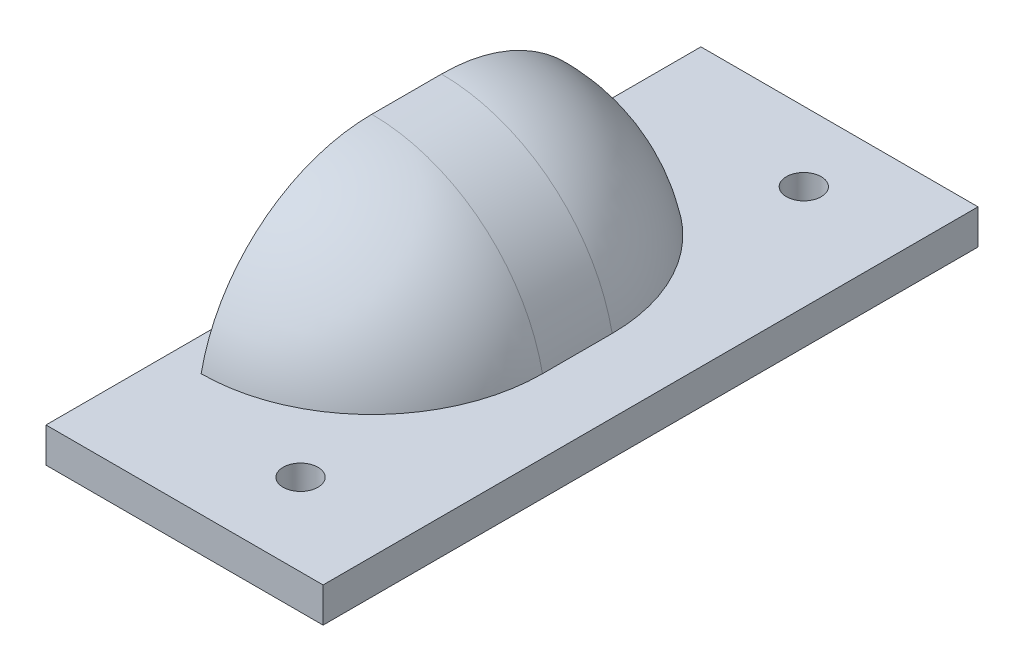
ISO-10303-21;
HEADER;
FILE_DESCRIPTION(('STEP AP214'),'2;1');
FILE_NAME('part.step','',(''),(''),'','','');
FILE_SCHEMA(('AUTOMOTIVE_DESIGN { 1 0 10303 214 1 1 1 1 }'));
ENDSEC;
DATA;
#1=APPLICATION_CONTEXT('core data for automotive mechanical design processes');
#2=APPLICATION_PROTOCOL_DEFINITION('international standard','automotive_design',2000,#1);
#3=PRODUCT_CONTEXT('',#1,'mechanical');
#4=PRODUCT('Part','Part','',(#3));
#5=PRODUCT_RELATED_PRODUCT_CATEGORY('part','',(#4));
#6=PRODUCT_DEFINITION_FORMATION('','',#4);
#7=PRODUCT_DEFINITION_CONTEXT('part definition',#1,'design');
#8=PRODUCT_DEFINITION('design','',#6,#7);
#9=PRODUCT_DEFINITION_SHAPE('','',#8);
#10=(LENGTH_UNIT() NAMED_UNIT(*) SI_UNIT(.MILLI.,.METRE.));
#11=(NAMED_UNIT(*) PLANE_ANGLE_UNIT() SI_UNIT($,.RADIAN.));
#12=(NAMED_UNIT(*) SI_UNIT($,.STERADIAN.) SOLID_ANGLE_UNIT());
#13=UNCERTAINTY_MEASURE_WITH_UNIT(LENGTH_MEASURE(1.E-05),#10,'distance_accuracy_value','');
#14=(GEOMETRIC_REPRESENTATION_CONTEXT(3) GLOBAL_UNCERTAINTY_ASSIGNED_CONTEXT((#13)) GLOBAL_UNIT_ASSIGNED_CONTEXT((#10,
#11,#12)) REPRESENTATION_CONTEXT('',''));
#15=CARTESIAN_POINT('',(0.,0.,0.));
#16=DIRECTION('',(0.,0.,1.));
#17=DIRECTION('',(1.,0.,0.));
#18=AXIS2_PLACEMENT_3D('',#15,#16,#17);
#19=CARTESIAN_POINT('',(-50.,-10.,100.));
#20=DIRECTION('',(-1.,0.,0.));
#21=DIRECTION('',(0.,0.,1.));
#22=AXIS2_PLACEMENT_3D('',#19,#20,#21);
#23=PLANE('',#22);
#24=DIRECTION('',(0.,1.,0.));
#25=VECTOR('',#24,1.);
#26=CARTESIAN_POINT('',(-50.,-10.0000000000477,95.7529648076036));
#27=LINE('',#26,#25);
#28=CARTESIAN_POINT('',(-50.,-10.0000000000477,95.7529648076036));
#29=VERTEX_POINT('',#28);
#30=CARTESIAN_POINT('',(-50.,0.,95.7529648076036));
#31=VERTEX_POINT('',#30);
#32=EDGE_CURVE('E135',#29,#31,#27,.T.);
#33=ORIENTED_EDGE('',*,*,#32,.T.);
#34=DIRECTION('',(0.,0.,1.));
#35=VECTOR('',#34,1.);
#36=CARTESIAN_POINT('',(-50.,0.,100.));
#37=LINE('',#36,#35);
#38=CARTESIAN_POINT('',(-50.,0.,-92.226624903704));
#39=VERTEX_POINT('',#38);
#40=EDGE_CURVE('E156',#39,#31,#37,.T.);
#41=ORIENTED_EDGE('',*,*,#40,.F.);
#42=DIRECTION('',(0.,1.,0.));
#43=VECTOR('',#42,1.);
#44=CARTESIAN_POINT('',(-50.,-10.0000000000477,-92.226624903704));
#45=LINE('',#44,#43);
#46=CARTESIAN_POINT('',(-50.,-10.,-92.226624903704));
#47=VERTEX_POINT('',#46);
#48=EDGE_CURVE('E146',#47,#39,#45,.T.);
#49=ORIENTED_EDGE('',*,*,#48,.F.);
#50=DIRECTION('',(0.,0.,1.));
#51=VECTOR('',#50,1.);
#52=CARTESIAN_POINT('',(-50.,-10.,100.));
#53=LINE('',#52,#51);
#54=EDGE_CURVE('E48',#47,#29,#53,.T.);
#55=ORIENTED_EDGE('',*,*,#54,.T.);
#56=EDGE_LOOP('',(#33,#41,#49,#55));
#57=FACE_BOUND('',#56,.T.);
#58=ADVANCED_FACE('F41',(#57),#23,.T.);
#59=CARTESIAN_POINT('',(0.,0.,0.));
#60=DIRECTION('',(0.,-1.,0.));
#61=DIRECTION('',(0.,0.,-1.));
#62=AXIS2_PLACEMENT_3D('',#59,#60,#61);
#63=PLANE('',#62);
#64=CARTESIAN_POINT('',(-0.46927151729978,0.,-72.226624903704));
#65=DIRECTION('',(0.,1.,0.));
#66=DIRECTION('',(0.,0.,1.));
#67=AXIS2_PLACEMENT_3D('',#64,#65,#66);
#68=CIRCLE('',#67,5.00000000000001);
#69=CARTESIAN_POINT('',(-0.46927151729978,0.,-67.226624903704));
#70=VERTEX_POINT('',#69);
#71=EDGE_CURVE('E250',#70,#70,#68,.T.);
#72=ORIENTED_EDGE('',*,*,#71,.F.);
#73=EDGE_LOOP('',(#72));
#74=FACE_BOUND('',#73,.T.);
#75=CARTESIAN_POINT('',(-0.46927151729978,0.,72.226624903704));
#76=DIRECTION('',(0.,1.,0.));
#77=DIRECTION('',(0.,0.,-1.));
#78=AXIS2_PLACEMENT_3D('',#75,#76,#77);
#79=CIRCLE('',#78,5.00000000000001);
#80=CARTESIAN_POINT('',(-0.46927151729978,0.,67.226624903704));
#81=VERTEX_POINT('',#80);
#82=EDGE_CURVE('E244',#81,#81,#79,.T.);
#83=ORIENTED_EDGE('',*,*,#82,.F.);
#84=EDGE_LOOP('',(#83));
#85=FACE_BOUND('',#84,.T.);
#86=ORIENTED_EDGE('',*,*,#40,.T.);
#87=DIRECTION('',(-1.,0.,0.));
#88=VECTOR('',#87,1.);
#89=CARTESIAN_POINT('',(0.,0.,95.7529648076036));
#90=LINE('',#89,#88);
#91=CARTESIAN_POINT('',(29.5307284827002,0.,95.7529648076036));
#92=VERTEX_POINT('',#91);
#93=EDGE_CURVE('E141',#92,#31,#90,.T.);
#94=ORIENTED_EDGE('',*,*,#93,.F.);
#95=DIRECTION('',(0.,0.,1.));
#96=VECTOR('',#95,1.);
#97=CARTESIAN_POINT('',(29.5307284827002,0.,0.));
#98=LINE('',#97,#96);
#99=CARTESIAN_POINT('',(29.5307284827002,0.,-92.226624903704));
#100=VERTEX_POINT('',#99);
#101=EDGE_CURVE('E154',#100,#92,#98,.T.);
#102=ORIENTED_EDGE('',*,*,#101,.F.);
#103=DIRECTION('',(-1.,0.,0.));
#104=VECTOR('',#103,1.);
#105=CARTESIAN_POINT('',(0.,0.,-92.226624903704));
#106=LINE('',#105,#104);
#107=EDGE_CURVE('E237',#100,#39,#106,.T.);
#108=ORIENTED_EDGE('',*,*,#107,.T.);
#109=EDGE_LOOP('',(#86,#94,#102,#108));
#110=FACE_BOUND('',#109,.T.);
#111=DIRECTION('',(0.,0.,1.));
#112=VECTOR('',#111,1.);
#113=CARTESIAN_POINT('',(-40.4692715172996,0.,1.41297706299227E-13));
#114=LINE('',#113,#112);
#115=CARTESIAN_POINT('',(-40.4692715172996,0.,-57.226624903704));
#116=VERTEX_POINT('',#115);
#117=CARTESIAN_POINT('',(-40.4692715172997,0.,-46.966663510112));
#118=VERTEX_POINT('',#117);
#119=EDGE_CURVE('E167',#116,#118,#114,.T.);
#120=ORIENTED_EDGE('',*,*,#119,.F.);
#121=CARTESIAN_POINT('',(-40.4692715172996,-4.77430595058337E-11,-8.2368300480502));
#122=DIRECTION('',(0.,-1.,0.));
#123=DIRECTION('',(1.,0.,0.));
#124=AXIS2_PLACEMENT_3D('',#121,#122,#123);
#125=CIRCLE('',#124,48.9897948556635);
#126=CARTESIAN_POINT('',(8.52052333836395,-4.77504320806066E-11,-8.2368300480502));
#127=VERTEX_POINT('',#126);
#128=EDGE_CURVE('E208',#127,#116,#125,.F.);
#129=ORIENTED_EDGE('',*,*,#128,.F.);
#130=DIRECTION('',(0.,0.,1.));
#131=VECTOR('',#130,1.);
#132=CARTESIAN_POINT('',(8.52052333836395,-4.77534678466895E-11,-8.23683004805019));
#133=LINE('',#132,#131);
#134=CARTESIAN_POINT('',(8.52052333835421,0.,11.7631699519498));
#135=VERTEX_POINT('',#134);
#136=EDGE_CURVE('E203',#135,#127,#133,.F.);
#137=ORIENTED_EDGE('',*,*,#136,.F.);
#138=CARTESIAN_POINT('',(-40.4692715172996,-4.77482636762616E-11,11.7631699519498));
#139=DIRECTION('',(0.,1.,0.));
#140=DIRECTION('',(-1.,0.,0.));
#141=AXIS2_PLACEMENT_3D('',#138,#139,#140);
#142=CIRCLE('',#141,48.9897948556635);
#143=CARTESIAN_POINT('',(-40.4692715172998,0.,60.7529648076036));
#144=VERTEX_POINT('',#143);
#145=EDGE_CURVE('E63',#144,#135,#142,.T.);
#146=ORIENTED_EDGE('',*,*,#145,.F.);
#147=CARTESIAN_POINT('',(-40.4692715172997,0.,50.4930034140116));
#148=VERTEX_POINT('',#147);
#149=EDGE_CURVE('E197',#148,#144,#114,.T.);
#150=ORIENTED_EDGE('',*,*,#149,.F.);
#151=DIRECTION('',(0.,0.,1.));
#152=VECTOR('',#151,1.);
#153=CARTESIAN_POINT('',(-40.4692715172996,0.,0.));
#154=LINE('',#153,#152);
#155=EDGE_CURVE('E11',#118,#148,#154,.T.);
#156=ORIENTED_EDGE('',*,*,#155,.F.);
#157=EDGE_LOOP('',(#120,#129,#137,#146,#150,#156));
#158=FACE_BOUND('',#157,.T.);
#159=ADVANCED_FACE('F265',(#74,#85,#110,#158),#63,.F.);
#160=CARTESIAN_POINT('',(0.,-10.,0.));
#161=DIRECTION('',(0.,-1.,0.));
#162=DIRECTION('',(0.,0.,-1.));
#163=AXIS2_PLACEMENT_3D('',#160,#161,#162);
#164=PLANE('',#163);
#165=CARTESIAN_POINT('',(-0.46927151729978,-10.0000000000477,-72.226624903704));
#166=DIRECTION('',(0.,1.,0.));
#167=DIRECTION('',(0.,0.,1.));
#168=AXIS2_PLACEMENT_3D('',#165,#166,#167);
#169=CIRCLE('',#168,5.00000000000001);
#170=CARTESIAN_POINT('',(-0.46927151729978,-10.0000000000477,-67.226624903704));
#171=VERTEX_POINT('',#170);
#172=EDGE_CURVE('E241',#171,#171,#169,.T.);
#173=ORIENTED_EDGE('',*,*,#172,.T.);
#174=EDGE_LOOP('',(#173));
#175=FACE_BOUND('',#174,.T.);
#176=CARTESIAN_POINT('',(-0.46927151729978,-10.0000000000477,72.226624903704));
#177=DIRECTION('',(0.,1.,0.));
#178=DIRECTION('',(0.,0.,-1.));
#179=AXIS2_PLACEMENT_3D('',#176,#177,#178);
#180=CIRCLE('',#179,5.00000000000001);
#181=CARTESIAN_POINT('',(-0.46927151729978,-10.0000000000477,67.226624903704));
#182=VERTEX_POINT('',#181);
#183=EDGE_CURVE('E247',#182,#182,#180,.T.);
#184=ORIENTED_EDGE('',*,*,#183,.T.);
#185=EDGE_LOOP('',(#184));
#186=FACE_BOUND('',#185,.T.);
#187=DIRECTION('',(-1.,0.,0.));
#188=VECTOR('',#187,1.);
#189=CARTESIAN_POINT('',(0.,-10.0000000000477,95.7529648076036));
#190=LINE('',#189,#188);
#191=CARTESIAN_POINT('',(29.5307284827002,-10.0000000000477,95.7529648076036));
#192=VERTEX_POINT('',#191);
#193=EDGE_CURVE('E138',#192,#29,#190,.T.);
#194=ORIENTED_EDGE('',*,*,#193,.T.);
#195=ORIENTED_EDGE('',*,*,#54,.F.);
#196=DIRECTION('',(-1.,0.,0.));
#197=VECTOR('',#196,1.);
#198=CARTESIAN_POINT('',(0.,-10.0000000000477,-92.226624903704));
#199=LINE('',#198,#197);
#200=CARTESIAN_POINT('',(29.5307284827002,-10.0000000000477,-92.226624903704));
#201=VERTEX_POINT('',#200);
#202=EDGE_CURVE('E55',#201,#47,#199,.T.);
#203=ORIENTED_EDGE('',*,*,#202,.F.);
#204=DIRECTION('',(0.,0.,1.));
#205=VECTOR('',#204,1.);
#206=CARTESIAN_POINT('',(29.5307284827002,-10.0000000000477,0.));
#207=LINE('',#206,#205);
#208=EDGE_CURVE('E147',#201,#192,#207,.T.);
#209=ORIENTED_EDGE('',*,*,#208,.T.);
#210=EDGE_LOOP('',(#194,#195,#203,#209));
#211=FACE_BOUND('',#210,.T.);
#212=CARTESIAN_POINT('',(-40.4692715172996,-10.0000000000477,-8.2368300480502));
#213=DIRECTION('',(0.,-1.,0.));
#214=DIRECTION('',(0.,0.,-1.));
#215=AXIS2_PLACEMENT_3D('',#212,#213,#214);
#216=CIRCLE('',#215,48.9897948556635);
#217=CARTESIAN_POINT('',(-40.4692715172996,-10.0000000000239,-57.2266249037137));
#218=VERTEX_POINT('',#217);
#219=CARTESIAN_POINT('',(8.52052333836395,-10.0000000000477,-8.23683004805019));
#220=VERTEX_POINT('',#219);
#221=EDGE_CURVE('E180',#218,#220,#216,.T.);
#222=ORIENTED_EDGE('',*,*,#221,.F.);
#223=DIRECTION('',(0.,0.,1.));
#224=VECTOR('',#223,1.);
#225=CARTESIAN_POINT('',(-40.4692715172996,-10.0000000000477,-8.23683004805019));
#226=LINE('',#225,#224);
#227=CARTESIAN_POINT('',(-40.4692715172996,-10.0000000000477,60.7529648076134));
#228=VERTEX_POINT('',#227);
#229=EDGE_CURVE('E186',#218,#228,#226,.T.);
#230=ORIENTED_EDGE('',*,*,#229,.T.);
#231=CARTESIAN_POINT('',(-40.4692715172996,-10.0000000000477,11.7631699519498));
#232=DIRECTION('',(0.,-1.,0.));
#233=DIRECTION('',(0.,0.,-1.));
#234=AXIS2_PLACEMENT_3D('',#231,#232,#233);
#235=CIRCLE('',#234,48.9897948556635);
#236=CARTESIAN_POINT('',(8.52052333836395,-10.0000000000477,11.7631699519498));
#237=VERTEX_POINT('',#236);
#238=EDGE_CURVE('E184',#237,#228,#235,.T.);
#239=ORIENTED_EDGE('',*,*,#238,.F.);
#240=DIRECTION('',(0.,0.,-1.));
#241=VECTOR('',#240,1.);
#242=CARTESIAN_POINT('',(8.52052333836395,-10.0000000000477,11.7631699519498));
#243=LINE('',#242,#241);
#244=EDGE_CURVE('E182',#220,#237,#243,.F.);
#245=ORIENTED_EDGE('',*,*,#244,.F.);
#246=EDGE_LOOP('',(#222,#230,#239,#245));
#247=FACE_BOUND('',#246,.T.);
#248=ADVANCED_FACE('F151',(#175,#186,#211,#247),#164,.T.);
#249=CARTESIAN_POINT('',(-40.4692715172996,-10.0000000000477,-8.23683004805019));
#250=DIRECTION('',(1.,0.,0.));
#251=DIRECTION('',(0.,-1.,0.));
#252=AXIS2_PLACEMENT_3D('',#249,#250,#251);
#253=PLANE('',#252);
#254=ORIENTED_EDGE('',*,*,#155,.T.);
#255=CARTESIAN_POINT('',(-40.4692715172996,-10.0000000000478,11.7631699519498));
#256=DIRECTION('',(-1.,0.,0.));
#257=DIRECTION('',(0.,0.,-1.));
#258=AXIS2_PLACEMENT_3D('',#255,#256,#257);
#259=CIRCLE('',#258,40.);
#260=CARTESIAN_POINT('',(-40.4692715172997,-2.00000000004775,50.9550058364806));
#261=VERTEX_POINT('',#260);
#262=EDGE_CURVE('E163',#261,#148,#259,.T.);
#263=ORIENTED_EDGE('',*,*,#262,.F.);
#264=CARTESIAN_POINT('',(-40.4692715172996,-4.77482636762616E-11,60.7529648076134));
#265=DIRECTION('',(1.,0.,0.));
#266=DIRECTION('',(0.,-1.,0.));
#267=AXIS2_PLACEMENT_3D('',#264,#265,#266);
#268=CIRCLE('',#267,10.);
#269=EDGE_CURVE('E158',#228,#261,#268,.T.);
#270=ORIENTED_EDGE('',*,*,#269,.F.);
#271=ORIENTED_EDGE('',*,*,#229,.F.);
#272=CARTESIAN_POINT('',(-40.4692715172996,-4.77482636762616E-11,-57.2266249037137));
#273=DIRECTION('',(1.,0.,0.));
#274=DIRECTION('',(0.,-1.,0.));
#275=AXIS2_PLACEMENT_3D('',#272,#273,#274);
#276=CIRCLE('',#275,10.);
#277=CARTESIAN_POINT('',(-40.4692715172997,-2.00000000004775,-47.428665932581));
#278=VERTEX_POINT('',#277);
#279=EDGE_CURVE('E169',#278,#218,#276,.T.);
#280=ORIENTED_EDGE('',*,*,#279,.F.);
#281=CARTESIAN_POINT('',(-40.4692715172996,-10.0000000000477,-8.2368300480502));
#282=DIRECTION('',(-1.,0.,0.));
#283=DIRECTION('',(0.,0.,-1.));
#284=AXIS2_PLACEMENT_3D('',#281,#282,#283);
#285=CIRCLE('',#284,40.);
#286=EDGE_CURVE('E192',#118,#278,#285,.T.);
#287=ORIENTED_EDGE('',*,*,#286,.F.);
#288=EDGE_LOOP('',(#254,#263,#270,#271,#280,#287));
#289=FACE_BOUND('',#288,.T.);
#290=ADVANCED_FACE('F291',(#289),#253,.T.);
#291=CARTESIAN_POINT('',(-40.4692715172996,-10.0000000000477,-8.23683004805019));
#292=DIRECTION('',(0.,0.,1.));
#293=DIRECTION('',(-1.,0.,0.));
#294=AXIS2_PLACEMENT_3D('',#291,#292,#293);
#295=CYLINDRICAL_SURFACE('',#294,40.);
#296=CARTESIAN_POINT('',(-40.4692715172996,-10.0000000000477,11.7631699519498));
#297=DIRECTION('',(0.,0.,-1.));
#298=DIRECTION('',(1.,0.,0.));
#299=AXIS2_PLACEMENT_3D('',#296,#297,#298);
#300=CIRCLE('',#299,40.);
#301=CARTESIAN_POINT('',(-40.4692715172996,29.9999999999522,11.7631699519498));
#302=VERTEX_POINT('',#301);
#303=CARTESIAN_POINT('',(-1.27743563276876,-2.00000000004775,11.7631699519498));
#304=VERTEX_POINT('',#303);
#305=EDGE_CURVE('E190',#302,#304,#300,.T.);
#306=ORIENTED_EDGE('',*,*,#305,.F.);
#307=DIRECTION('',(0.,0.,1.));
#308=VECTOR('',#307,1.);
#309=CARTESIAN_POINT('',(-40.4692715172996,29.9999999999522,-8.23683004805019));
#310=LINE('',#309,#308);
#311=CARTESIAN_POINT('',(-40.4692715172996,29.9999999999522,-8.23683004805019));
#312=VERTEX_POINT('',#311);
#313=EDGE_CURVE('E201',#312,#302,#310,.T.);
#314=ORIENTED_EDGE('',*,*,#313,.F.);
#315=CARTESIAN_POINT('',(-40.4692715172996,-10.0000000000477,-8.23683004805019));
#316=DIRECTION('',(0.,0.,-1.));
#317=DIRECTION('',(1.,0.,0.));
#318=AXIS2_PLACEMENT_3D('',#315,#316,#317);
#319=CIRCLE('',#318,40.);
#320=CARTESIAN_POINT('',(-1.27743563276876,-2.00000000004775,-8.23683004805019));
#321=VERTEX_POINT('',#320);
#322=EDGE_CURVE('E189',#312,#321,#319,.T.);
#323=ORIENTED_EDGE('',*,*,#322,.T.);
#324=DIRECTION('',(0.,0.,1.));
#325=VECTOR('',#324,1.);
#326=CARTESIAN_POINT('',(-1.27743563276876,-2.00000000004775,-8.23683004805019));
#327=LINE('',#326,#325);
#328=EDGE_CURVE('E174',#304,#321,#327,.F.);
#329=ORIENTED_EDGE('',*,*,#328,.F.);
#330=EDGE_LOOP('',(#306,#314,#323,#329));
#331=FACE_BOUND('',#330,.T.);
#332=ADVANCED_FACE('F310',(#331),#295,.F.);
#333=CARTESIAN_POINT('',(-40.4692715172996,-10.0000000000477,-8.2368300480502));
#334=DIRECTION('',(0.,-1.,0.));
#335=DIRECTION('',(0.,0.,1.));
#336=AXIS2_PLACEMENT_3D('',#333,#334,#335);
#337=SPHERICAL_SURFACE('',#336,40.);
#338=ORIENTED_EDGE('',*,*,#322,.F.);
#339=CARTESIAN_POINT('',(-40.4692715172996,-10.0000000000477,-8.2368300480502));
#340=DIRECTION('',(-1.,0.,0.));
#341=DIRECTION('',(0.,0.,-1.));
#342=AXIS2_PLACEMENT_3D('',#339,#340,#341);
#343=CIRCLE('',#342,40.);
#344=EDGE_CURVE('E226',#312,#118,#343,.T.);
#345=ORIENTED_EDGE('',*,*,#344,.T.);
#346=ORIENTED_EDGE('',*,*,#286,.T.);
#347=CARTESIAN_POINT('',(-40.4692715172996,-2.00000000004775,-8.2368300480502));
#348=DIRECTION('',(0.,-1.,0.));
#349=DIRECTION('',(0.,0.,-1.));
#350=AXIS2_PLACEMENT_3D('',#347,#348,#349);
#351=CIRCLE('',#350,39.1918358845308);
#352=EDGE_CURVE('E177',#321,#278,#351,.F.);
#353=ORIENTED_EDGE('',*,*,#352,.F.);
#354=EDGE_LOOP('',(#338,#345,#346,#353));
#355=FACE_BOUND('',#354,.T.);
#356=ADVANCED_FACE('F296',(#355),#337,.F.);
#357=CARTESIAN_POINT('',(-40.4692715172996,-10.0000000000478,11.7631699519498));
#358=DIRECTION('',(0.,1.,0.));
#359=DIRECTION('',(0.,0.,1.));
#360=AXIS2_PLACEMENT_3D('',#357,#358,#359);
#361=SPHERICAL_SURFACE('',#360,40.);
#362=ORIENTED_EDGE('',*,*,#262,.T.);
#363=CARTESIAN_POINT('',(-40.4692715172996,-10.0000000000478,11.7631699519498));
#364=DIRECTION('',(-1.,0.,0.));
#365=DIRECTION('',(0.,0.,-1.));
#366=AXIS2_PLACEMENT_3D('',#363,#364,#365);
#367=CIRCLE('',#366,40.);
#368=EDGE_CURVE('E199',#148,#302,#367,.T.);
#369=ORIENTED_EDGE('',*,*,#368,.T.);
#370=ORIENTED_EDGE('',*,*,#305,.T.);
#371=CARTESIAN_POINT('',(-40.4692715172996,-2.00000000004775,11.7631699519498));
#372=DIRECTION('',(0.,-1.,0.));
#373=DIRECTION('',(0.,0.,-1.));
#374=AXIS2_PLACEMENT_3D('',#371,#372,#373);
#375=CIRCLE('',#374,39.1918358845308);
#376=EDGE_CURVE('E171',#261,#304,#375,.F.);
#377=ORIENTED_EDGE('',*,*,#376,.F.);
#378=EDGE_LOOP('',(#362,#369,#370,#377));
#379=FACE_BOUND('',#378,.T.);
#380=ADVANCED_FACE('F288',(#379),#361,.F.);
#381=CARTESIAN_POINT('',(-40.4692715172996,-4.77482636762616E-11,11.7631699519498));
#382=DIRECTION('',(0.,-1.,0.));
#383=DIRECTION('',(0.,0.,-1.));
#384=AXIS2_PLACEMENT_3D('',#381,#382,#383);
#385=TOROIDAL_SURFACE('',#384,48.9897948556635,10.);
#386=ORIENTED_EDGE('',*,*,#269,.T.);
#387=ORIENTED_EDGE('',*,*,#376,.T.);
#388=CARTESIAN_POINT('',(8.52052333836395,-4.77465289527856E-11,11.7631699519498));
#389=DIRECTION('',(0.,0.,1.));
#390=DIRECTION('',(-1.,0.,0.));
#391=AXIS2_PLACEMENT_3D('',#388,#389,#390);
#392=CIRCLE('',#391,10.);
#393=EDGE_CURVE('E160',#304,#237,#392,.T.);
#394=ORIENTED_EDGE('',*,*,#393,.T.);
#395=ORIENTED_EDGE('',*,*,#238,.T.);
#396=EDGE_LOOP('',(#386,#387,#394,#395));
#397=FACE_BOUND('',#396,.T.);
#398=ADVANCED_FACE('F308',(#397),#385,.T.);
#399=CARTESIAN_POINT('',(8.52052333836395,-4.77482636762616E-11,-8.23683004805019));
#400=DIRECTION('',(0.,0.,1.));
#401=DIRECTION('',(-1.,0.,0.));
#402=AXIS2_PLACEMENT_3D('',#399,#400,#401);
#403=CYLINDRICAL_SURFACE('',#402,10.);
#404=ORIENTED_EDGE('',*,*,#393,.F.);
#405=ORIENTED_EDGE('',*,*,#328,.T.);
#406=CARTESIAN_POINT('',(8.52052333836395,-4.77465289527856E-11,-8.23683004805019));
#407=DIRECTION('',(0.,0.,1.));
#408=DIRECTION('',(-1.,0.,0.));
#409=AXIS2_PLACEMENT_3D('',#406,#407,#408);
#410=CIRCLE('',#409,10.);
#411=EDGE_CURVE('E164',#321,#220,#410,.T.);
#412=ORIENTED_EDGE('',*,*,#411,.T.);
#413=ORIENTED_EDGE('',*,*,#244,.T.);
#414=EDGE_LOOP('',(#404,#405,#412,#413));
#415=FACE_BOUND('',#414,.T.);
#416=ADVANCED_FACE('F304',(#415),#403,.T.);
#417=CARTESIAN_POINT('',(-40.4692715172996,-4.77482636762616E-11,-8.2368300480502));
#418=DIRECTION('',(0.,-1.,0.));
#419=DIRECTION('',(0.,0.,-1.));
#420=AXIS2_PLACEMENT_3D('',#417,#418,#419);
#421=TOROIDAL_SURFACE('',#420,48.9897948556635,10.);
#422=ORIENTED_EDGE('',*,*,#279,.T.);
#423=ORIENTED_EDGE('',*,*,#221,.T.);
#424=ORIENTED_EDGE('',*,*,#411,.F.);
#425=ORIENTED_EDGE('',*,*,#352,.T.);
#426=EDGE_LOOP('',(#422,#423,#424,#425));
#427=FACE_BOUND('',#426,.T.);
#428=ADVANCED_FACE('F299',(#427),#421,.T.);
#429=CARTESIAN_POINT('',(-40.4692715172996,-10.0000000000477,-8.2368300480502));
#430=DIRECTION('',(1.,0.,0.));
#431=DIRECTION('',(0.,0.,-1.));
#432=AXIS2_PLACEMENT_3D('',#429,#430,#431);
#433=PLANE('',#432);
#434=CARTESIAN_POINT('',(-40.4692715172996,-10.0000000000477,-8.2368300480502));
#435=DIRECTION('',(-1.,0.,0.));
#436=DIRECTION('',(0.,0.,1.));
#437=AXIS2_PLACEMENT_3D('',#434,#435,#436);
#438=CIRCLE('',#437,50.);
#439=CARTESIAN_POINT('',(-40.4692715172996,39.9999999999522,-8.23683004805019));
#440=VERTEX_POINT('',#439);
#441=EDGE_CURVE('E211',#440,#116,#438,.T.);
#442=ORIENTED_EDGE('',*,*,#441,.T.);
#443=ORIENTED_EDGE('',*,*,#119,.T.);
#444=ORIENTED_EDGE('',*,*,#344,.F.);
#445=ORIENTED_EDGE('',*,*,#313,.T.);
#446=ORIENTED_EDGE('',*,*,#368,.F.);
#447=ORIENTED_EDGE('',*,*,#149,.T.);
#448=CARTESIAN_POINT('',(-40.4692715172996,-10.0000000000478,11.7631699519498));
#449=DIRECTION('',(-1.,0.,0.));
#450=DIRECTION('',(0.,0.,1.));
#451=AXIS2_PLACEMENT_3D('',#448,#449,#450);
#452=CIRCLE('',#451,50.);
#453=CARTESIAN_POINT('',(-40.4692715172996,39.9999999999522,11.7631699519498));
#454=VERTEX_POINT('',#453);
#455=EDGE_CURVE('E202',#144,#454,#452,.T.);
#456=ORIENTED_EDGE('',*,*,#455,.T.);
#457=DIRECTION('',(0.,0.,1.));
#458=VECTOR('',#457,1.);
#459=CARTESIAN_POINT('',(-40.4692715172996,39.9999999999522,-8.23683004805019));
#460=LINE('',#459,#458);
#461=EDGE_CURVE('E212',#440,#454,#460,.T.);
#462=ORIENTED_EDGE('',*,*,#461,.F.);
#463=EDGE_LOOP('',(#442,#443,#444,#445,#446,#447,#456,#462));
#464=FACE_BOUND('',#463,.T.);
#465=ADVANCED_FACE('F276',(#464),#433,.F.);
#466=CARTESIAN_POINT('',(-40.4692715172996,-10.0000000000478,11.7631699519498));
#467=DIRECTION('',(0.,1.,0.));
#468=DIRECTION('',(0.,0.,1.));
#469=AXIS2_PLACEMENT_3D('',#466,#467,#468);
#470=SPHERICAL_SURFACE('',#469,50.);
#471=ORIENTED_EDGE('',*,*,#455,.F.);
#472=ORIENTED_EDGE('',*,*,#145,.T.);
#473=CARTESIAN_POINT('',(-40.4692715172996,-10.0000000000477,11.7631699519498));
#474=DIRECTION('',(0.,0.,1.));
#475=DIRECTION('',(1.,0.,0.));
#476=AXIS2_PLACEMENT_3D('',#473,#474,#475);
#477=CIRCLE('',#476,50.);
#478=EDGE_CURVE('E207',#454,#135,#477,.F.);
#479=ORIENTED_EDGE('',*,*,#478,.F.);
#480=EDGE_LOOP('',(#471,#472,#479));
#481=FACE_BOUND('',#480,.T.);
#482=ADVANCED_FACE('F283',(#481),#470,.T.);
#483=CARTESIAN_POINT('',(-40.4692715172996,-10.0000000000477,-8.2368300480502));
#484=DIRECTION('',(0.,-1.,0.));
#485=DIRECTION('',(0.,0.,1.));
#486=AXIS2_PLACEMENT_3D('',#483,#484,#485);
#487=SPHERICAL_SURFACE('',#486,50.);
#488=CARTESIAN_POINT('',(-40.4692715172996,-10.0000000000477,-8.2368300480502));
#489=DIRECTION('',(0.,0.,-1.));
#490=DIRECTION('',(-1.,0.,0.));
#491=AXIS2_PLACEMENT_3D('',#488,#489,#490);
#492=CIRCLE('',#491,50.);
#493=EDGE_CURVE('E206',#440,#127,#492,.T.);
#494=ORIENTED_EDGE('',*,*,#493,.T.);
#495=ORIENTED_EDGE('',*,*,#128,.T.);
#496=ORIENTED_EDGE('',*,*,#441,.F.);
#497=EDGE_LOOP('',(#494,#495,#496));
#498=FACE_BOUND('',#497,.T.);
#499=ADVANCED_FACE('F278',(#498),#487,.T.);
#500=CARTESIAN_POINT('',(-40.4692715172996,-10.0000000000477,-8.23683004805019));
#501=DIRECTION('',(0.,0.,1.));
#502=DIRECTION('',(-1.,0.,0.));
#503=AXIS2_PLACEMENT_3D('',#500,#501,#502);
#504=CYLINDRICAL_SURFACE('',#503,50.);
#505=ORIENTED_EDGE('',*,*,#478,.T.);
#506=ORIENTED_EDGE('',*,*,#136,.T.);
#507=ORIENTED_EDGE('',*,*,#493,.F.);
#508=ORIENTED_EDGE('',*,*,#461,.T.);
#509=EDGE_LOOP('',(#505,#506,#507,#508));
#510=FACE_BOUND('',#509,.T.);
#511=ADVANCED_FACE('F280',(#510),#504,.T.);
#512=CARTESIAN_POINT('',(0.,-10.0000000000477,95.7529648076036));
#513=DIRECTION('',(0.,0.,-1.));
#514=DIRECTION('',(-1.,0.,0.));
#515=AXIS2_PLACEMENT_3D('',#512,#513,#514);
#516=PLANE('',#515);
#517=ORIENTED_EDGE('',*,*,#93,.T.);
#518=ORIENTED_EDGE('',*,*,#32,.F.);
#519=ORIENTED_EDGE('',*,*,#193,.F.);
#520=DIRECTION('',(0.,1.,0.));
#521=VECTOR('',#520,1.);
#522=CARTESIAN_POINT('',(29.5307284827002,-10.0000000000477,95.7529648076036));
#523=LINE('',#522,#521);
#524=EDGE_CURVE('E223',#192,#92,#523,.T.);
#525=ORIENTED_EDGE('',*,*,#524,.T.);
#526=EDGE_LOOP('',(#517,#518,#519,#525));
#527=FACE_BOUND('',#526,.T.);
#528=ADVANCED_FACE('F137',(#527),#516,.F.);
#529=CARTESIAN_POINT('',(29.5307284827002,-10.0000000000477,0.));
#530=DIRECTION('',(-1.,0.,0.));
#531=DIRECTION('',(0.,0.,1.));
#532=AXIS2_PLACEMENT_3D('',#529,#530,#531);
#533=PLANE('',#532);
#534=ORIENTED_EDGE('',*,*,#101,.T.);
#535=ORIENTED_EDGE('',*,*,#524,.F.);
#536=ORIENTED_EDGE('',*,*,#208,.F.);
#537=DIRECTION('',(0.,1.,0.));
#538=VECTOR('',#537,1.);
#539=CARTESIAN_POINT('',(29.5307284827002,-10.0000000000477,-92.226624903704));
#540=LINE('',#539,#538);
#541=EDGE_CURVE('E232',#201,#100,#540,.T.);
#542=ORIENTED_EDGE('',*,*,#541,.T.);
#543=EDGE_LOOP('',(#534,#535,#536,#542));
#544=FACE_BOUND('',#543,.T.);
#545=ADVANCED_FACE('F427',(#544),#533,.F.);
#546=CARTESIAN_POINT('',(0.,-10.0000000000477,-92.226624903704));
#547=DIRECTION('',(0.,0.,-1.));
#548=DIRECTION('',(-1.,0.,0.));
#549=AXIS2_PLACEMENT_3D('',#546,#547,#548);
#550=PLANE('',#549);
#551=ORIENTED_EDGE('',*,*,#107,.F.);
#552=ORIENTED_EDGE('',*,*,#541,.F.);
#553=ORIENTED_EDGE('',*,*,#202,.T.);
#554=ORIENTED_EDGE('',*,*,#48,.T.);
#555=EDGE_LOOP('',(#551,#552,#553,#554));
#556=FACE_BOUND('',#555,.T.);
#557=ADVANCED_FACE('F434',(#556),#550,.T.);
#558=CARTESIAN_POINT('',(-0.46927151729978,-10.0000000000477,72.226624903704));
#559=DIRECTION('',(0.,1.,0.));
#560=DIRECTION('',(0.,0.,1.));
#561=AXIS2_PLACEMENT_3D('',#558,#559,#560);
#562=CYLINDRICAL_SURFACE('',#561,5.00000000000001);
#563=ORIENTED_EDGE('',*,*,#183,.F.);
#564=EDGE_LOOP('',(#563));
#565=FACE_BOUND('',#564,.T.);
#566=ORIENTED_EDGE('',*,*,#82,.T.);
#567=EDGE_LOOP('',(#566));
#568=FACE_BOUND('',#567,.T.);
#569=ADVANCED_FACE('F261',(#565,#568),#562,.F.);
#570=CARTESIAN_POINT('',(-0.46927151729978,-10.0000000000477,-72.226624903704));
#571=DIRECTION('',(0.,1.,0.));
#572=DIRECTION('',(0.,0.,1.));
#573=AXIS2_PLACEMENT_3D('',#570,#571,#572);
#574=CYLINDRICAL_SURFACE('',#573,5.00000000000001);
#575=ORIENTED_EDGE('',*,*,#172,.F.);
#576=EDGE_LOOP('',(#575));
#577=FACE_BOUND('',#576,.T.);
#578=ORIENTED_EDGE('',*,*,#71,.T.);
#579=EDGE_LOOP('',(#578));
#580=FACE_BOUND('',#579,.T.);
#581=ADVANCED_FACE('F258',(#577,#580),#574,.F.);
#582=CLOSED_SHELL('',(#58,#159,#248,#290,#332,#356,#380,#398,#416,#428,#465,#482,#499,#511,#528,
#545,#557,#569,#581));
#583=MANIFOLD_SOLID_BREP('B2',#582);
#584=ADVANCED_BREP_SHAPE_REPRESENTATION('',(#18,#583),#14);
#585=SHAPE_DEFINITION_REPRESENTATION(#9,#584);
ENDSEC;
END-ISO-10303-21;
